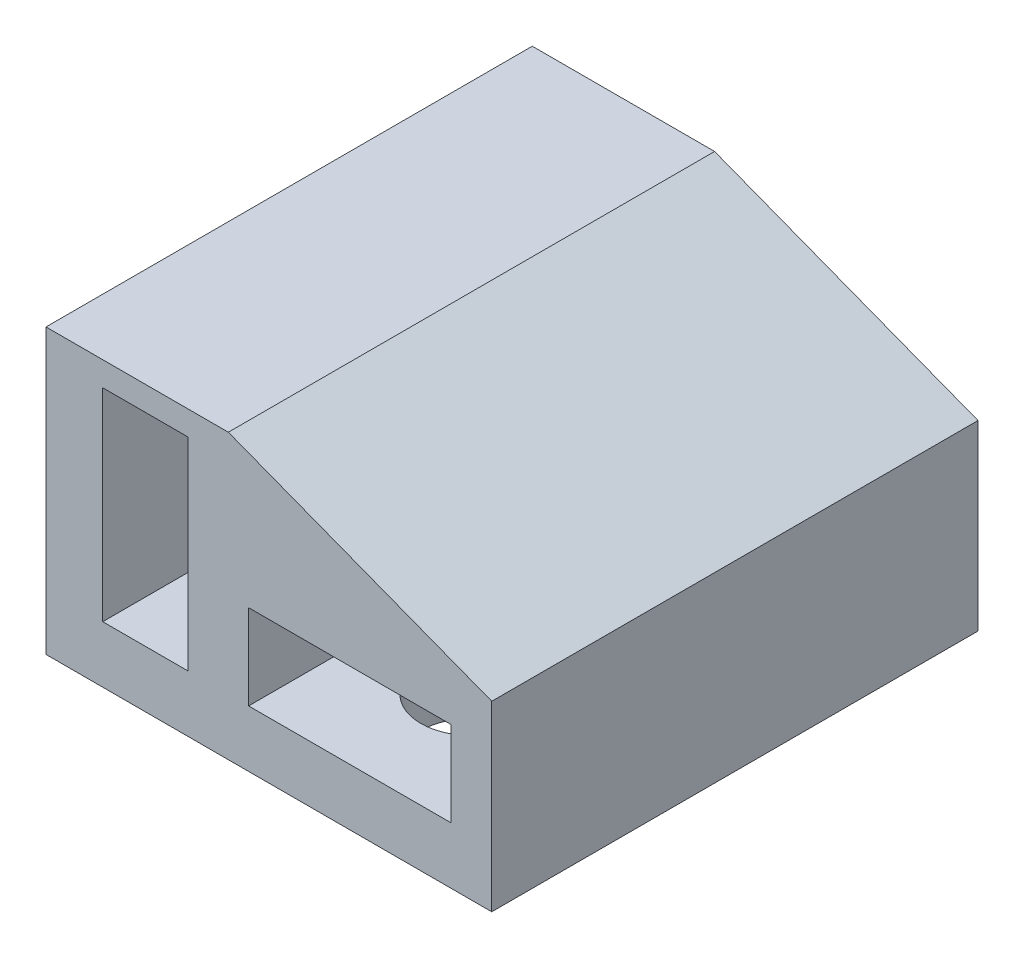
ISO-10303-21;
HEADER;
FILE_DESCRIPTION(('STEP AP214'),'2;1');
FILE_NAME('part.step','',(''),(''),'','','');
FILE_SCHEMA(('AUTOMOTIVE_DESIGN { 1 0 10303 214 1 1 1 1 }'));
ENDSEC;
DATA;
#1=APPLICATION_CONTEXT('core data for automotive mechanical design processes');
#2=APPLICATION_PROTOCOL_DEFINITION('international standard','automotive_design',2000,#1);
#3=PRODUCT_CONTEXT('',#1,'mechanical');
#4=PRODUCT('Part','Part','',(#3));
#5=PRODUCT_RELATED_PRODUCT_CATEGORY('part','',(#4));
#6=PRODUCT_DEFINITION_FORMATION('','',#4);
#7=PRODUCT_DEFINITION_CONTEXT('part definition',#1,'design');
#8=PRODUCT_DEFINITION('design','',#6,#7);
#9=PRODUCT_DEFINITION_SHAPE('','',#8);
#10=(LENGTH_UNIT() NAMED_UNIT(*) SI_UNIT(.MILLI.,.METRE.));
#11=(NAMED_UNIT(*) PLANE_ANGLE_UNIT() SI_UNIT($,.RADIAN.));
#12=(NAMED_UNIT(*) SI_UNIT($,.STERADIAN.) SOLID_ANGLE_UNIT());
#13=UNCERTAINTY_MEASURE_WITH_UNIT(LENGTH_MEASURE(1.E-05),#10,'distance_accuracy_value','');
#14=(GEOMETRIC_REPRESENTATION_CONTEXT(3) GLOBAL_UNCERTAINTY_ASSIGNED_CONTEXT((#13)) GLOBAL_UNIT_ASSIGNED_CONTEXT((#10,
#11,#12)) REPRESENTATION_CONTEXT('',''));
#15=CARTESIAN_POINT('',(0.,0.,0.));
#16=DIRECTION('',(0.,0.,1.));
#17=DIRECTION('',(1.,0.,0.));
#18=AXIS2_PLACEMENT_3D('',#15,#16,#17);
#19=CARTESIAN_POINT('',(0.,0.,12.));
#20=DIRECTION('',(0.,1.,0.));
#21=DIRECTION('',(0.,0.,1.));
#22=AXIS2_PLACEMENT_3D('',#19,#20,#21);
#23=PLANE('',#22);
#24=CARTESIAN_POINT('',(7.5,0.,9.));
#25=DIRECTION('',(0.,-1.,0.));
#26=DIRECTION('',(0.,0.,-1.));
#27=AXIS2_PLACEMENT_3D('',#24,#25,#26);
#28=CIRCLE('',#27,1.25);
#29=CARTESIAN_POINT('',(7.5,0.,7.75));
#30=VERTEX_POINT('',#29);
#31=EDGE_CURVE('E545',#30,#30,#28,.T.);
#32=ORIENTED_EDGE('',*,*,#31,.F.);
#33=EDGE_LOOP('',(#32));
#34=FACE_BOUND('',#33,.T.);
#35=CARTESIAN_POINT('',(7.5,0.,3.));
#36=DIRECTION('',(0.,-1.,0.));
#37=DIRECTION('',(0.,0.,-1.));
#38=AXIS2_PLACEMENT_3D('',#35,#36,#37);
#39=CIRCLE('',#38,1.25);
#40=CARTESIAN_POINT('',(7.5,0.,1.75));
#41=VERTEX_POINT('',#40);
#42=EDGE_CURVE('E549',#41,#41,#39,.T.);
#43=ORIENTED_EDGE('',*,*,#42,.F.);
#44=EDGE_LOOP('',(#43));
#45=FACE_BOUND('',#44,.T.);
#46=DIRECTION('',(1.,0.,0.));
#47=VECTOR('',#46,1.);
#48=CARTESIAN_POINT('',(0.,0.,0.));
#49=LINE('',#48,#47);
#50=CARTESIAN_POINT('',(0.,0.,0.));
#51=VERTEX_POINT('',#50);
#52=CARTESIAN_POINT('',(11.,0.,0.));
#53=VERTEX_POINT('',#52);
#54=EDGE_CURVE('E383',#51,#53,#49,.T.);
#55=ORIENTED_EDGE('',*,*,#54,.T.);
#56=DIRECTION('',(0.,0.,-1.));
#57=VECTOR('',#56,1.);
#58=CARTESIAN_POINT('',(11.,0.,12.));
#59=LINE('',#58,#57);
#60=CARTESIAN_POINT('',(11.,0.,12.));
#61=VERTEX_POINT('',#60);
#62=EDGE_CURVE('E480',#61,#53,#59,.T.);
#63=ORIENTED_EDGE('',*,*,#62,.F.);
#64=DIRECTION('',(1.,0.,0.));
#65=VECTOR('',#64,1.);
#66=CARTESIAN_POINT('',(0.,0.,12.));
#67=LINE('',#66,#65);
#68=CARTESIAN_POINT('',(0.,0.,12.));
#69=VERTEX_POINT('',#68);
#70=EDGE_CURVE('E435',#69,#61,#67,.T.);
#71=ORIENTED_EDGE('',*,*,#70,.F.);
#72=DIRECTION('',(0.,0.,-1.));
#73=VECTOR('',#72,1.);
#74=CARTESIAN_POINT('',(0.,0.,12.));
#75=LINE('',#74,#73);
#76=EDGE_CURVE('E451',#69,#51,#75,.T.);
#77=ORIENTED_EDGE('',*,*,#76,.T.);
#78=EDGE_LOOP('',(#55,#63,#71,#77));
#79=FACE_BOUND('',#78,.T.);
#80=ADVANCED_FACE('F78',(#34,#45,#79),#23,.F.);
#81=CARTESIAN_POINT('',(11.,0.,12.));
#82=DIRECTION('',(-1.,0.,0.));
#83=DIRECTION('',(0.,0.,1.));
#84=AXIS2_PLACEMENT_3D('',#81,#82,#83);
#85=PLANE('',#84);
#86=DIRECTION('',(0.,0.,-1.));
#87=VECTOR('',#86,1.);
#88=CARTESIAN_POINT('',(11.,4.5,12.));
#89=LINE('',#88,#87);
#90=CARTESIAN_POINT('',(11.,4.5,12.));
#91=VERTEX_POINT('',#90);
#92=CARTESIAN_POINT('',(11.,4.5,0.));
#93=VERTEX_POINT('',#92);
#94=EDGE_CURVE('E476',#91,#93,#89,.T.);
#95=ORIENTED_EDGE('',*,*,#94,.F.);
#96=DIRECTION('',(0.,1.,0.));
#97=VECTOR('',#96,1.);
#98=CARTESIAN_POINT('',(11.,0.,12.));
#99=LINE('',#98,#97);
#100=EDGE_CURVE('E438',#61,#91,#99,.T.);
#101=ORIENTED_EDGE('',*,*,#100,.F.);
#102=ORIENTED_EDGE('',*,*,#62,.T.);
#103=DIRECTION('',(0.,1.,0.));
#104=VECTOR('',#103,1.);
#105=CARTESIAN_POINT('',(11.,0.,0.));
#106=LINE('',#105,#104);
#107=EDGE_CURVE('E454',#53,#93,#106,.T.);
#108=ORIENTED_EDGE('',*,*,#107,.T.);
#109=EDGE_LOOP('',(#95,#101,#102,#108));
#110=FACE_BOUND('',#109,.T.);
#111=ADVANCED_FACE('F535',(#110),#85,.F.);
#112=CARTESIAN_POINT('',(4.5,7.,12.));
#113=DIRECTION('',(-0.358979079308869,-0.933345606203059,0.));
#114=DIRECTION('',(0.93334560620306,-0.358979079308869,0.));
#115=AXIS2_PLACEMENT_3D('',#112,#113,#114);
#116=PLANE('',#115);
#117=DIRECTION('',(-0.93334560620306,0.358979079308869,0.));
#118=VECTOR('',#117,1.);
#119=CARTESIAN_POINT('',(4.5,7.,0.));
#120=LINE('',#119,#118);
#121=CARTESIAN_POINT('',(4.5,7.,0.));
#122=VERTEX_POINT('',#121);
#123=EDGE_CURVE('E457',#93,#122,#120,.T.);
#124=ORIENTED_EDGE('',*,*,#123,.T.);
#125=DIRECTION('',(0.,0.,-1.));
#126=VECTOR('',#125,1.);
#127=CARTESIAN_POINT('',(4.5,7.,12.));
#128=LINE('',#127,#126);
#129=CARTESIAN_POINT('',(4.5,7.,12.));
#130=VERTEX_POINT('',#129);
#131=EDGE_CURVE('E472',#130,#122,#128,.T.);
#132=ORIENTED_EDGE('',*,*,#131,.F.);
#133=DIRECTION('',(-0.93334560620306,0.358979079308869,0.));
#134=VECTOR('',#133,1.);
#135=CARTESIAN_POINT('',(4.5,7.,12.));
#136=LINE('',#135,#134);
#137=EDGE_CURVE('E442',#91,#130,#136,.T.);
#138=ORIENTED_EDGE('',*,*,#137,.F.);
#139=ORIENTED_EDGE('',*,*,#94,.T.);
#140=EDGE_LOOP('',(#124,#132,#138,#139));
#141=FACE_BOUND('',#140,.T.);
#142=ADVANCED_FACE('F540',(#141),#116,.F.);
#143=CARTESIAN_POINT('',(0.,7.,12.));
#144=DIRECTION('',(0.,-1.,0.));
#145=DIRECTION('',(0.,0.,-1.));
#146=AXIS2_PLACEMENT_3D('',#143,#144,#145);
#147=PLANE('',#146);
#148=DIRECTION('',(-1.,0.,0.));
#149=VECTOR('',#148,1.);
#150=CARTESIAN_POINT('',(0.,7.,0.));
#151=LINE('',#150,#149);
#152=CARTESIAN_POINT('',(0.,7.,0.));
#153=VERTEX_POINT('',#152);
#154=EDGE_CURVE('E460',#122,#153,#151,.T.);
#155=ORIENTED_EDGE('',*,*,#154,.T.);
#156=DIRECTION('',(0.,0.,-1.));
#157=VECTOR('',#156,1.);
#158=CARTESIAN_POINT('',(0.,7.,12.));
#159=LINE('',#158,#157);
#160=CARTESIAN_POINT('',(0.,7.,12.));
#161=VERTEX_POINT('',#160);
#162=EDGE_CURVE('E468',#161,#153,#159,.T.);
#163=ORIENTED_EDGE('',*,*,#162,.F.);
#164=DIRECTION('',(-1.,0.,0.));
#165=VECTOR('',#164,1.);
#166=CARTESIAN_POINT('',(0.,7.,12.));
#167=LINE('',#166,#165);
#168=EDGE_CURVE('E445',#130,#161,#167,.T.);
#169=ORIENTED_EDGE('',*,*,#168,.F.);
#170=ORIENTED_EDGE('',*,*,#131,.T.);
#171=EDGE_LOOP('',(#155,#163,#169,#170));
#172=FACE_BOUND('',#171,.T.);
#173=ADVANCED_FACE('F570',(#172),#147,.F.);
#174=CARTESIAN_POINT('',(0.,0.,12.));
#175=DIRECTION('',(1.,0.,0.));
#176=DIRECTION('',(0.,0.,-1.));
#177=AXIS2_PLACEMENT_3D('',#174,#175,#176);
#178=PLANE('',#177);
#179=CARTESIAN_POINT('',(0.,3.9,3.5));
#180=DIRECTION('',(-1.,0.,0.));
#181=DIRECTION('',(0.,0.,1.));
#182=AXIS2_PLACEMENT_3D('',#179,#180,#181);
#183=CIRCLE('',#182,1.25);
#184=CARTESIAN_POINT('',(0.,3.9,4.75));
#185=VERTEX_POINT('',#184);
#186=EDGE_CURVE('E489',#185,#185,#183,.T.);
#187=ORIENTED_EDGE('',*,*,#186,.F.);
#188=EDGE_LOOP('',(#187));
#189=FACE_BOUND('',#188,.T.);
#190=CARTESIAN_POINT('',(0.,3.9,8.5));
#191=DIRECTION('',(-1.,0.,0.));
#192=DIRECTION('',(0.,0.,1.));
#193=AXIS2_PLACEMENT_3D('',#190,#191,#192);
#194=CIRCLE('',#193,1.25);
#195=CARTESIAN_POINT('',(0.,3.9,9.75));
#196=VERTEX_POINT('',#195);
#197=EDGE_CURVE('E642',#196,#196,#194,.T.);
#198=ORIENTED_EDGE('',*,*,#197,.F.);
#199=EDGE_LOOP('',(#198));
#200=FACE_BOUND('',#199,.T.);
#201=DIRECTION('',(0.,-1.,0.));
#202=VECTOR('',#201,1.);
#203=CARTESIAN_POINT('',(0.,0.,0.));
#204=LINE('',#203,#202);
#205=EDGE_CURVE('E439',#153,#51,#204,.T.);
#206=ORIENTED_EDGE('',*,*,#205,.T.);
#207=ORIENTED_EDGE('',*,*,#76,.F.);
#208=DIRECTION('',(0.,-1.,0.));
#209=VECTOR('',#208,1.);
#210=CARTESIAN_POINT('',(0.,0.,12.));
#211=LINE('',#210,#209);
#212=EDGE_CURVE('E448',#161,#69,#211,.T.);
#213=ORIENTED_EDGE('',*,*,#212,.F.);
#214=ORIENTED_EDGE('',*,*,#162,.T.);
#215=EDGE_LOOP('',(#206,#207,#213,#214));
#216=FACE_BOUND('',#215,.T.);
#217=ADVANCED_FACE('F568',(#189,#200,#216),#178,.F.);
#218=CARTESIAN_POINT('',(0.,0.,12.));
#219=DIRECTION('',(0.,0.,1.));
#220=DIRECTION('',(1.,0.,0.));
#221=AXIS2_PLACEMENT_3D('',#218,#219,#220);
#222=PLANE('',#221);
#223=DIRECTION('',(0.,-1.,0.));
#224=VECTOR('',#223,1.);
#225=CARTESIAN_POINT('',(10.,3.5,12.));
#226=LINE('',#225,#224);
#227=CARTESIAN_POINT('',(10.,3.5,12.));
#228=VERTEX_POINT('',#227);
#229=CARTESIAN_POINT('',(10.,1.4,12.));
#230=VERTEX_POINT('',#229);
#231=EDGE_CURVE('E292',#228,#230,#226,.T.);
#232=ORIENTED_EDGE('',*,*,#231,.T.);
#233=DIRECTION('',(1.,0.,0.));
#234=VECTOR('',#233,1.);
#235=CARTESIAN_POINT('',(11.,1.4,12.));
#236=LINE('',#235,#234);
#237=CARTESIAN_POINT('',(5.,1.4,12.));
#238=VERTEX_POINT('',#237);
#239=EDGE_CURVE('E259',#238,#230,#236,.T.);
#240=ORIENTED_EDGE('',*,*,#239,.F.);
#241=DIRECTION('',(0.,-1.,0.));
#242=VECTOR('',#241,1.);
#243=CARTESIAN_POINT('',(5.,3.5,12.));
#244=LINE('',#243,#242);
#245=CARTESIAN_POINT('',(5.,3.5,12.));
#246=VERTEX_POINT('',#245);
#247=EDGE_CURVE('E295',#246,#238,#244,.T.);
#248=ORIENTED_EDGE('',*,*,#247,.F.);
#249=DIRECTION('',(-1.,0.,0.));
#250=VECTOR('',#249,1.);
#251=CARTESIAN_POINT('',(0.,3.5,12.));
#252=LINE('',#251,#250);
#253=EDGE_CURVE('E311',#228,#246,#252,.T.);
#254=ORIENTED_EDGE('',*,*,#253,.F.);
#255=EDGE_LOOP('',(#232,#240,#248,#254));
#256=FACE_BOUND('',#255,.T.);
#257=ORIENTED_EDGE('',*,*,#100,.T.);
#258=ORIENTED_EDGE('',*,*,#137,.T.);
#259=ORIENTED_EDGE('',*,*,#168,.T.);
#260=ORIENTED_EDGE('',*,*,#212,.T.);
#261=ORIENTED_EDGE('',*,*,#70,.T.);
#262=EDGE_LOOP('',(#257,#258,#259,#260,#261));
#263=FACE_BOUND('',#262,.T.);
#264=DIRECTION('',(-1.,0.,0.));
#265=VECTOR('',#264,1.);
#266=CARTESIAN_POINT('',(3.5,1.4,12.));
#267=LINE('',#266,#265);
#268=CARTESIAN_POINT('',(3.5,1.4,12.));
#269=VERTEX_POINT('',#268);
#270=CARTESIAN_POINT('',(1.4,1.4,12.));
#271=VERTEX_POINT('',#270);
#272=EDGE_CURVE('E417',#269,#271,#267,.T.);
#273=ORIENTED_EDGE('',*,*,#272,.T.);
#274=DIRECTION('',(0.,1.,0.));
#275=VECTOR('',#274,1.);
#276=CARTESIAN_POINT('',(1.4,0.,12.));
#277=LINE('',#276,#275);
#278=CARTESIAN_POINT('',(1.4,6.4,12.));
#279=VERTEX_POINT('',#278);
#280=EDGE_CURVE('E328',#271,#279,#277,.T.);
#281=ORIENTED_EDGE('',*,*,#280,.T.);
#282=DIRECTION('',(-1.,0.,0.));
#283=VECTOR('',#282,1.);
#284=CARTESIAN_POINT('',(3.5,6.4,12.));
#285=LINE('',#284,#283);
#286=CARTESIAN_POINT('',(3.5,6.4,12.));
#287=VERTEX_POINT('',#286);
#288=EDGE_CURVE('E429',#287,#279,#285,.T.);
#289=ORIENTED_EDGE('',*,*,#288,.F.);
#290=DIRECTION('',(0.,1.,0.));
#291=VECTOR('',#290,1.);
#292=CARTESIAN_POINT('',(3.5,0.,12.));
#293=LINE('',#292,#291);
#294=EDGE_CURVE('E401',#269,#287,#293,.T.);
#295=ORIENTED_EDGE('',*,*,#294,.F.);
#296=EDGE_LOOP('',(#273,#281,#289,#295));
#297=FACE_BOUND('',#296,.T.);
#298=ADVANCED_FACE('F514',(#256,#263,#297),#222,.T.);
#299=CARTESIAN_POINT('',(0.,0.,0.));
#300=DIRECTION('',(0.,0.,1.));
#301=DIRECTION('',(1.,0.,0.));
#302=AXIS2_PLACEMENT_3D('',#299,#300,#301);
#303=PLANE('',#302);
#304=DIRECTION('',(1.,0.,0.));
#305=VECTOR('',#304,1.);
#306=CARTESIAN_POINT('',(11.,1.4,0.));
#307=LINE('',#306,#305);
#308=CARTESIAN_POINT('',(5.,1.4,0.));
#309=VERTEX_POINT('',#308);
#310=CARTESIAN_POINT('',(10.,1.4,0.));
#311=VERTEX_POINT('',#310);
#312=EDGE_CURVE('E247',#309,#311,#307,.T.);
#313=ORIENTED_EDGE('',*,*,#312,.T.);
#314=DIRECTION('',(0.,-1.,0.));
#315=VECTOR('',#314,1.);
#316=CARTESIAN_POINT('',(10.,3.5,0.));
#317=LINE('',#316,#315);
#318=CARTESIAN_POINT('',(10.,3.5,0.));
#319=VERTEX_POINT('',#318);
#320=EDGE_CURVE('E278',#319,#311,#317,.T.);
#321=ORIENTED_EDGE('',*,*,#320,.F.);
#322=DIRECTION('',(1.,0.,0.));
#323=VECTOR('',#322,1.);
#324=CARTESIAN_POINT('',(0.,3.5,0.));
#325=LINE('',#324,#323);
#326=CARTESIAN_POINT('',(5.,3.5,0.));
#327=VERTEX_POINT('',#326);
#328=EDGE_CURVE('E276',#327,#319,#325,.T.);
#329=ORIENTED_EDGE('',*,*,#328,.F.);
#330=DIRECTION('',(0.,-1.,0.));
#331=VECTOR('',#330,1.);
#332=CARTESIAN_POINT('',(5.,3.5,0.));
#333=LINE('',#332,#331);
#334=EDGE_CURVE('E267',#327,#309,#333,.T.);
#335=ORIENTED_EDGE('',*,*,#334,.T.);
#336=EDGE_LOOP('',(#313,#321,#329,#335));
#337=FACE_BOUND('',#336,.T.);
#338=ORIENTED_EDGE('',*,*,#123,.F.);
#339=ORIENTED_EDGE('',*,*,#107,.F.);
#340=ORIENTED_EDGE('',*,*,#54,.F.);
#341=ORIENTED_EDGE('',*,*,#205,.F.);
#342=ORIENTED_EDGE('',*,*,#154,.F.);
#343=EDGE_LOOP('',(#338,#339,#340,#341,#342));
#344=FACE_BOUND('',#343,.T.);
#345=DIRECTION('',(0.,1.,0.));
#346=VECTOR('',#345,1.);
#347=CARTESIAN_POINT('',(1.4,0.,0.));
#348=LINE('',#347,#346);
#349=CARTESIAN_POINT('',(1.4,1.4,0.));
#350=VERTEX_POINT('',#349);
#351=CARTESIAN_POINT('',(1.4,6.4,0.));
#352=VERTEX_POINT('',#351);
#353=EDGE_CURVE('E324',#350,#352,#348,.T.);
#354=ORIENTED_EDGE('',*,*,#353,.F.);
#355=DIRECTION('',(-1.,0.,0.));
#356=VECTOR('',#355,1.);
#357=CARTESIAN_POINT('',(3.5,1.4,0.));
#358=LINE('',#357,#356);
#359=CARTESIAN_POINT('',(3.5,1.4,0.));
#360=VERTEX_POINT('',#359);
#361=EDGE_CURVE('E378',#360,#350,#358,.T.);
#362=ORIENTED_EDGE('',*,*,#361,.F.);
#363=DIRECTION('',(0.,-1.,0.));
#364=VECTOR('',#363,1.);
#365=CARTESIAN_POINT('',(3.5,0.,0.));
#366=LINE('',#365,#364);
#367=CARTESIAN_POINT('',(3.5,6.4,0.));
#368=VERTEX_POINT('',#367);
#369=EDGE_CURVE('E358',#368,#360,#366,.T.);
#370=ORIENTED_EDGE('',*,*,#369,.F.);
#371=DIRECTION('',(-1.,0.,0.));
#372=VECTOR('',#371,1.);
#373=CARTESIAN_POINT('',(3.5,6.4,0.));
#374=LINE('',#373,#372);
#375=EDGE_CURVE('E379',#368,#352,#374,.T.);
#376=ORIENTED_EDGE('',*,*,#375,.T.);
#377=EDGE_LOOP('',(#354,#362,#370,#376));
#378=FACE_BOUND('',#377,.T.);
#379=ADVANCED_FACE('F273',(#337,#344,#378),#303,.F.);
#380=CARTESIAN_POINT('',(3.5,6.4,0.));
#381=DIRECTION('',(0.,1.,0.));
#382=DIRECTION('',(0.,0.,1.));
#383=AXIS2_PLACEMENT_3D('',#380,#381,#382);
#384=PLANE('',#383);
#385=DIRECTION('',(-1.,0.,0.));
#386=VECTOR('',#385,1.);
#387=CARTESIAN_POINT('',(3.5,6.4,4.44337567297406));
#388=LINE('',#387,#386);
#389=CARTESIAN_POINT('',(3.5,6.4,4.44337567297406));
#390=VERTEX_POINT('',#389);
#391=CARTESIAN_POINT('',(1.4,6.4,4.44337567297406));
#392=VERTEX_POINT('',#391);
#393=EDGE_CURVE('E384',#390,#392,#388,.T.);
#394=ORIENTED_EDGE('',*,*,#393,.T.);
#395=DIRECTION('',(0.,0.,-1.));
#396=VECTOR('',#395,1.);
#397=CARTESIAN_POINT('',(1.4,6.4,0.));
#398=LINE('',#397,#396);
#399=EDGE_CURVE('E353',#392,#352,#398,.T.);
#400=ORIENTED_EDGE('',*,*,#399,.T.);
#401=ORIENTED_EDGE('',*,*,#375,.F.);
#402=DIRECTION('',(0.,0.,-1.));
#403=VECTOR('',#402,1.);
#404=CARTESIAN_POINT('',(3.5,6.4,0.));
#405=LINE('',#404,#403);
#406=EDGE_CURVE('E375',#390,#368,#405,.T.);
#407=ORIENTED_EDGE('',*,*,#406,.F.);
#408=EDGE_LOOP('',(#394,#400,#401,#407));
#409=FACE_BOUND('',#408,.T.);
#410=ADVANCED_FACE('F584',(#409),#384,.F.);
#411=CARTESIAN_POINT('',(3.5,3.52403810567665,6.10381304684075));
#412=DIRECTION('',(0.,0.5,0.866025403784439));
#413=DIRECTION('',(0.,-0.866025403784439,0.5));
#414=AXIS2_PLACEMENT_3D('',#411,#412,#413);
#415=PLANE('',#414);
#416=DIRECTION('',(-1.,0.,0.));
#417=VECTOR('',#416,1.);
#418=CARTESIAN_POINT('',(3.5,3.9,5.88675134594812));
#419=LINE('',#418,#417);
#420=CARTESIAN_POINT('',(3.5,3.9,5.88675134594812));
#421=VERTEX_POINT('',#420);
#422=CARTESIAN_POINT('',(1.4,3.9,5.88675134594812));
#423=VERTEX_POINT('',#422);
#424=EDGE_CURVE('E388',#421,#423,#419,.T.);
#425=ORIENTED_EDGE('',*,*,#424,.T.);
#426=DIRECTION('',(0.,0.866025403784439,-0.5));
#427=VECTOR('',#426,1.);
#428=CARTESIAN_POINT('',(1.4,3.52403810567665,6.10381304684075));
#429=LINE('',#428,#427);
#430=EDGE_CURVE('E349',#423,#392,#429,.T.);
#431=ORIENTED_EDGE('',*,*,#430,.T.);
#432=ORIENTED_EDGE('',*,*,#393,.F.);
#433=DIRECTION('',(0.,0.866025403784439,-0.5));
#434=VECTOR('',#433,1.);
#435=CARTESIAN_POINT('',(3.5,3.52403810567665,6.10381304684075));
#436=LINE('',#435,#434);
#437=EDGE_CURVE('E371',#421,#390,#436,.T.);
#438=ORIENTED_EDGE('',*,*,#437,.F.);
#439=EDGE_LOOP('',(#425,#431,#432,#438));
#440=FACE_BOUND('',#439,.T.);
#441=ADVANCED_FACE('F607',(#440),#415,.F.);
#442=CARTESIAN_POINT('',(3.5,-1.57403810567666,2.72631397208144));
#443=DIRECTION('',(0.,-0.499999999999999,0.866025403784439));
#444=DIRECTION('',(0.,-0.866025403784439,-0.499999999999999));
#445=AXIS2_PLACEMENT_3D('',#442,#443,#444);
#446=PLANE('',#445);
#447=DIRECTION('',(-1.,0.,0.));
#448=VECTOR('',#447,1.);
#449=CARTESIAN_POINT('',(3.5,1.4,4.44337567297406));
#450=LINE('',#449,#448);
#451=CARTESIAN_POINT('',(3.5,1.4,4.44337567297406));
#452=VERTEX_POINT('',#451);
#453=CARTESIAN_POINT('',(1.4,1.4,4.44337567297406));
#454=VERTEX_POINT('',#453);
#455=EDGE_CURVE('E392',#452,#454,#450,.T.);
#456=ORIENTED_EDGE('',*,*,#455,.T.);
#457=DIRECTION('',(0.,0.866025403784439,0.499999999999999));
#458=VECTOR('',#457,1.);
#459=CARTESIAN_POINT('',(1.4,-1.57403810567666,2.72631397208144));
#460=LINE('',#459,#458);
#461=EDGE_CURVE('E345',#454,#423,#460,.T.);
#462=ORIENTED_EDGE('',*,*,#461,.T.);
#463=ORIENTED_EDGE('',*,*,#424,.F.);
#464=DIRECTION('',(0.,0.866025403784439,0.5));
#465=VECTOR('',#464,1.);
#466=CARTESIAN_POINT('',(3.5,-1.57403810567666,2.72631397208144));
#467=LINE('',#466,#465);
#468=EDGE_CURVE('E367',#452,#421,#467,.T.);
#469=ORIENTED_EDGE('',*,*,#468,.F.);
#470=EDGE_LOOP('',(#456,#462,#463,#469));
#471=FACE_BOUND('',#470,.T.);
#472=ADVANCED_FACE('F600',(#471),#446,.F.);
#473=CARTESIAN_POINT('',(3.5,1.4,0.));
#474=DIRECTION('',(0.,-1.,0.));
#475=DIRECTION('',(0.,0.,-1.));
#476=AXIS2_PLACEMENT_3D('',#473,#474,#475);
#477=PLANE('',#476);
#478=ORIENTED_EDGE('',*,*,#361,.T.);
#479=DIRECTION('',(0.,0.,1.));
#480=VECTOR('',#479,1.);
#481=CARTESIAN_POINT('',(1.4,1.4,0.));
#482=LINE('',#481,#480);
#483=EDGE_CURVE('E341',#350,#454,#482,.T.);
#484=ORIENTED_EDGE('',*,*,#483,.T.);
#485=ORIENTED_EDGE('',*,*,#455,.F.);
#486=DIRECTION('',(0.,0.,1.));
#487=VECTOR('',#486,1.);
#488=CARTESIAN_POINT('',(3.5,1.4,0.));
#489=LINE('',#488,#487);
#490=EDGE_CURVE('E362',#360,#452,#489,.T.);
#491=ORIENTED_EDGE('',*,*,#490,.F.);
#492=EDGE_LOOP('',(#478,#484,#485,#491));
#493=FACE_BOUND('',#492,.T.);
#494=ADVANCED_FACE('F594',(#493),#477,.F.);
#495=CARTESIAN_POINT('',(3.5,0.,0.));
#496=DIRECTION('',(-1.,0.,0.));
#497=DIRECTION('',(0.,0.,1.));
#498=AXIS2_PLACEMENT_3D('',#495,#496,#497);
#499=PLANE('',#498);
#500=ORIENTED_EDGE('',*,*,#369,.T.);
#501=ORIENTED_EDGE('',*,*,#490,.T.);
#502=ORIENTED_EDGE('',*,*,#468,.T.);
#503=ORIENTED_EDGE('',*,*,#437,.T.);
#504=ORIENTED_EDGE('',*,*,#406,.T.);
#505=EDGE_LOOP('',(#500,#501,#502,#503,#504));
#506=FACE_BOUND('',#505,.T.);
#507=ADVANCED_FACE('F588',(#506),#499,.T.);
#508=CARTESIAN_POINT('',(3.5,1.4,0.));
#509=DIRECTION('',(0.,-1.,0.));
#510=DIRECTION('',(0.,0.,-1.));
#511=AXIS2_PLACEMENT_3D('',#508,#509,#510);
#512=PLANE('',#511);
#513=DIRECTION('',(-1.,0.,0.));
#514=VECTOR('',#513,1.);
#515=CARTESIAN_POINT('',(3.5,1.4,7.55662432702594));
#516=LINE('',#515,#514);
#517=CARTESIAN_POINT('',(3.5,1.4,7.55662432702594));
#518=VERTEX_POINT('',#517);
#519=CARTESIAN_POINT('',(1.4,1.4,7.55662432702594));
#520=VERTEX_POINT('',#519);
#521=EDGE_CURVE('E363',#518,#520,#516,.T.);
#522=ORIENTED_EDGE('',*,*,#521,.T.);
#523=DIRECTION('',(0.,0.,1.));
#524=VECTOR('',#523,1.);
#525=CARTESIAN_POINT('',(1.4,1.4,0.));
#526=LINE('',#525,#524);
#527=EDGE_CURVE('E338',#520,#271,#526,.T.);
#528=ORIENTED_EDGE('',*,*,#527,.T.);
#529=ORIENTED_EDGE('',*,*,#272,.F.);
#530=DIRECTION('',(0.,0.,1.));
#531=VECTOR('',#530,1.);
#532=CARTESIAN_POINT('',(3.5,1.4,0.));
#533=LINE('',#532,#531);
#534=EDGE_CURVE('E357',#518,#269,#533,.T.);
#535=ORIENTED_EDGE('',*,*,#534,.F.);
#536=EDGE_LOOP('',(#522,#528,#529,#535));
#537=FACE_BOUND('',#536,.T.);
#538=ADVANCED_FACE('F510',(#537),#512,.F.);
#539=CARTESIAN_POINT('',(3.5,3.62211431702997,6.27368602791856));
#540=DIRECTION('',(0.,-0.5,-0.866025403784439));
#541=DIRECTION('',(0.,0.866025403784439,-0.5));
#542=AXIS2_PLACEMENT_3D('',#539,#540,#541);
#543=PLANE('',#542);
#544=DIRECTION('',(-1.,0.,0.));
#545=VECTOR('',#544,1.);
#546=CARTESIAN_POINT('',(3.5,3.9,6.11324865405187));
#547=LINE('',#546,#545);
#548=CARTESIAN_POINT('',(3.5,3.9,6.11324865405187));
#549=VERTEX_POINT('',#548);
#550=CARTESIAN_POINT('',(1.4,3.9,6.11324865405187));
#551=VERTEX_POINT('',#550);
#552=EDGE_CURVE('E421',#549,#551,#547,.T.);
#553=ORIENTED_EDGE('',*,*,#552,.T.);
#554=DIRECTION('',(0.,-0.866025403784439,0.5));
#555=VECTOR('',#554,1.);
#556=CARTESIAN_POINT('',(1.4,3.62211431702997,6.27368602791856));
#557=LINE('',#556,#555);
#558=EDGE_CURVE('E335',#551,#520,#557,.T.);
#559=ORIENTED_EDGE('',*,*,#558,.T.);
#560=ORIENTED_EDGE('',*,*,#521,.F.);
#561=DIRECTION('',(0.,-0.866025403784439,0.5));
#562=VECTOR('',#561,1.);
#563=CARTESIAN_POINT('',(3.5,3.62211431702997,6.27368602791856));
#564=LINE('',#563,#562);
#565=EDGE_CURVE('E413',#549,#518,#564,.T.);
#566=ORIENTED_EDGE('',*,*,#565,.F.);
#567=EDGE_LOOP('',(#553,#559,#560,#566));
#568=FACE_BOUND('',#567,.T.);
#569=ADVANCED_FACE('F520',(#568),#543,.F.);
#570=CARTESIAN_POINT('',(3.5,-1.67211431702998,2.89618695315925));
#571=DIRECTION('',(0.,0.5,-0.866025403784439));
#572=DIRECTION('',(0.,0.866025403784439,0.5));
#573=AXIS2_PLACEMENT_3D('',#570,#571,#572);
#574=PLANE('',#573);
#575=DIRECTION('',(-1.,0.,0.));
#576=VECTOR('',#575,1.);
#577=CARTESIAN_POINT('',(3.5,6.4,7.55662432702594));
#578=LINE('',#577,#576);
#579=CARTESIAN_POINT('',(3.5,6.4,7.55662432702594));
#580=VERTEX_POINT('',#579);
#581=CARTESIAN_POINT('',(1.4,6.4,7.55662432702594));
#582=VERTEX_POINT('',#581);
#583=EDGE_CURVE('E425',#580,#582,#578,.T.);
#584=ORIENTED_EDGE('',*,*,#583,.T.);
#585=DIRECTION('',(0.,-0.866025403784439,-0.5));
#586=VECTOR('',#585,1.);
#587=CARTESIAN_POINT('',(1.4,-1.67211431702998,2.89618695315925));
#588=LINE('',#587,#586);
#589=EDGE_CURVE('E327',#582,#551,#588,.T.);
#590=ORIENTED_EDGE('',*,*,#589,.T.);
#591=ORIENTED_EDGE('',*,*,#552,.F.);
#592=DIRECTION('',(0.,-0.866025403784439,-0.5));
#593=VECTOR('',#592,1.);
#594=CARTESIAN_POINT('',(3.5,-1.67211431702998,2.89618695315925));
#595=LINE('',#594,#593);
#596=EDGE_CURVE('E409',#580,#549,#595,.T.);
#597=ORIENTED_EDGE('',*,*,#596,.F.);
#598=EDGE_LOOP('',(#584,#590,#591,#597));
#599=FACE_BOUND('',#598,.T.);
#600=ADVANCED_FACE('F522',(#599),#574,.F.);
#601=CARTESIAN_POINT('',(3.5,6.4,0.));
#602=DIRECTION('',(0.,1.,0.));
#603=DIRECTION('',(0.,0.,1.));
#604=AXIS2_PLACEMENT_3D('',#601,#602,#603);
#605=PLANE('',#604);
#606=ORIENTED_EDGE('',*,*,#288,.T.);
#607=DIRECTION('',(0.,0.,-1.));
#608=VECTOR('',#607,1.);
#609=CARTESIAN_POINT('',(1.4,6.4,0.));
#610=LINE('',#609,#608);
#611=EDGE_CURVE('E87',#279,#582,#610,.T.);
#612=ORIENTED_EDGE('',*,*,#611,.T.);
#613=ORIENTED_EDGE('',*,*,#583,.F.);
#614=DIRECTION('',(0.,0.,-1.));
#615=VECTOR('',#614,1.);
#616=CARTESIAN_POINT('',(3.5,6.4,0.));
#617=LINE('',#616,#615);
#618=EDGE_CURVE('E405',#287,#580,#617,.T.);
#619=ORIENTED_EDGE('',*,*,#618,.F.);
#620=EDGE_LOOP('',(#606,#612,#613,#619));
#621=FACE_BOUND('',#620,.T.);
#622=ADVANCED_FACE('F524',(#621),#605,.F.);
#623=CARTESIAN_POINT('',(3.5,0.,0.));
#624=DIRECTION('',(-1.,0.,0.));
#625=DIRECTION('',(0.,0.,1.));
#626=AXIS2_PLACEMENT_3D('',#623,#624,#625);
#627=PLANE('',#626);
#628=ORIENTED_EDGE('',*,*,#534,.T.);
#629=ORIENTED_EDGE('',*,*,#294,.T.);
#630=ORIENTED_EDGE('',*,*,#618,.T.);
#631=ORIENTED_EDGE('',*,*,#596,.T.);
#632=ORIENTED_EDGE('',*,*,#565,.T.);
#633=EDGE_LOOP('',(#628,#629,#630,#631,#632));
#634=FACE_BOUND('',#633,.T.);
#635=ADVANCED_FACE('F501',(#634),#627,.T.);
#636=CARTESIAN_POINT('',(1.4,0.,0.));
#637=DIRECTION('',(1.,0.,0.));
#638=DIRECTION('',(0.,0.,-1.));
#639=AXIS2_PLACEMENT_3D('',#636,#637,#638);
#640=PLANE('',#639);
#641=CARTESIAN_POINT('',(1.4,3.9,8.5));
#642=DIRECTION('',(1.,0.,0.));
#643=DIRECTION('',(0.,0.,-1.));
#644=AXIS2_PLACEMENT_3D('',#641,#642,#643);
#645=CIRCLE('',#644,1.25);
#646=CARTESIAN_POINT('',(1.4,3.9,7.25));
#647=VERTEX_POINT('',#646);
#648=EDGE_CURVE('E260',#647,#647,#645,.T.);
#649=ORIENTED_EDGE('',*,*,#648,.F.);
#650=EDGE_LOOP('',(#649));
#651=FACE_BOUND('',#650,.T.);
#652=ORIENTED_EDGE('',*,*,#527,.F.);
#653=ORIENTED_EDGE('',*,*,#558,.F.);
#654=ORIENTED_EDGE('',*,*,#589,.F.);
#655=ORIENTED_EDGE('',*,*,#611,.F.);
#656=ORIENTED_EDGE('',*,*,#280,.F.);
#657=EDGE_LOOP('',(#652,#653,#654,#655,#656));
#658=FACE_BOUND('',#657,.T.);
#659=ADVANCED_FACE('F497',(#651,#658),#640,.T.);
#660=CARTESIAN_POINT('',(1.4,3.9,3.5));
#661=DIRECTION('',(1.,0.,0.));
#662=DIRECTION('',(0.,0.,-1.));
#663=AXIS2_PLACEMENT_3D('',#660,#661,#662);
#664=CIRCLE('',#663,1.25);
#665=CARTESIAN_POINT('',(1.4,3.9,2.25));
#666=VERTEX_POINT('',#665);
#667=EDGE_CURVE('E486',#666,#666,#664,.T.);
#668=ORIENTED_EDGE('',*,*,#667,.F.);
#669=EDGE_LOOP('',(#668));
#670=FACE_BOUND('',#669,.T.);
#671=ORIENTED_EDGE('',*,*,#399,.F.);
#672=ORIENTED_EDGE('',*,*,#430,.F.);
#673=ORIENTED_EDGE('',*,*,#461,.F.);
#674=ORIENTED_EDGE('',*,*,#483,.F.);
#675=ORIENTED_EDGE('',*,*,#353,.T.);
#676=EDGE_LOOP('',(#671,#672,#673,#674,#675));
#677=FACE_BOUND('',#676,.T.);
#678=ADVANCED_FACE('F500',(#670,#677),#640,.T.);
#679=CARTESIAN_POINT('',(-0.674038105676657,3.5,1.16746824526945));
#680=DIRECTION('',(-0.500000000000001,0.,0.866025403784438));
#681=DIRECTION('',(0.866025403784438,0.,0.500000000000001));
#682=AXIS2_PLACEMENT_3D('',#679,#680,#681);
#683=PLANE('',#682);
#684=DIRECTION('',(0.,-1.,0.));
#685=VECTOR('',#684,1.);
#686=CARTESIAN_POINT('',(7.5,3.5,5.88675134594813));
#687=LINE('',#686,#685);
#688=CARTESIAN_POINT('',(7.5,3.5,5.88675134594813));
#689=VERTEX_POINT('',#688);
#690=CARTESIAN_POINT('',(7.5,1.4,5.88675134594813));
#691=VERTEX_POINT('',#690);
#692=EDGE_CURVE('E332',#689,#691,#687,.T.);
#693=ORIENTED_EDGE('',*,*,#692,.T.);
#694=DIRECTION('',(-0.866025403784438,0.,-0.500000000000001));
#695=VECTOR('',#694,1.);
#696=CARTESIAN_POINT('',(-0.674038105676657,1.4,1.16746824526945));
#697=LINE('',#696,#695);
#698=CARTESIAN_POINT('',(5.,1.4,4.44337567297406));
#699=VERTEX_POINT('',#698);
#700=EDGE_CURVE('E271',#691,#699,#697,.T.);
#701=ORIENTED_EDGE('',*,*,#700,.T.);
#702=DIRECTION('',(0.,-1.,0.));
#703=VECTOR('',#702,1.);
#704=CARTESIAN_POINT('',(5.,3.5,4.44337567297406));
#705=LINE('',#704,#703);
#706=CARTESIAN_POINT('',(5.,3.5,4.44337567297406));
#707=VERTEX_POINT('',#706);
#708=EDGE_CURVE('E269',#707,#699,#705,.T.);
#709=ORIENTED_EDGE('',*,*,#708,.F.);
#710=DIRECTION('',(-0.866025403784438,0.,-0.500000000000001));
#711=VECTOR('',#710,1.);
#712=CARTESIAN_POINT('',(-0.674038105676657,3.5,1.16746824526945));
#713=LINE('',#712,#711);
#714=EDGE_CURVE('E323',#689,#707,#713,.T.);
#715=ORIENTED_EDGE('',*,*,#714,.F.);
#716=EDGE_LOOP('',(#693,#701,#709,#715));
#717=FACE_BOUND('',#716,.T.);
#718=ADVANCED_FACE('F625',(#717),#683,.F.);
#719=CARTESIAN_POINT('',(4.42403810567666,3.5,7.66265877365274));
#720=DIRECTION('',(0.5,0.,0.866025403784439));
#721=DIRECTION('',(0.866025403784439,0.,-0.5));
#722=AXIS2_PLACEMENT_3D('',#719,#720,#721);
#723=PLANE('',#722);
#724=DIRECTION('',(0.,-1.,0.));
#725=VECTOR('',#724,1.);
#726=CARTESIAN_POINT('',(10.,3.5,4.44337567297406));
#727=LINE('',#726,#725);
#728=CARTESIAN_POINT('',(10.,3.5,4.44337567297406));
#729=VERTEX_POINT('',#728);
#730=CARTESIAN_POINT('',(10.,1.4,4.44337567297406));
#731=VERTEX_POINT('',#730);
#732=EDGE_CURVE('E282',#729,#731,#727,.T.);
#733=ORIENTED_EDGE('',*,*,#732,.T.);
#734=DIRECTION('',(-0.866025403784439,0.,0.5));
#735=VECTOR('',#734,1.);
#736=CARTESIAN_POINT('',(4.42403810567666,1.4,7.66265877365274));
#737=LINE('',#736,#735);
#738=EDGE_CURVE('E664',#731,#691,#737,.T.);
#739=ORIENTED_EDGE('',*,*,#738,.T.);
#740=ORIENTED_EDGE('',*,*,#692,.F.);
#741=DIRECTION('',(-0.866025403784439,0.,0.5));
#742=VECTOR('',#741,1.);
#743=CARTESIAN_POINT('',(4.42403810567666,3.5,7.66265877365274));
#744=LINE('',#743,#742);
#745=EDGE_CURVE('E284',#729,#689,#744,.T.);
#746=ORIENTED_EDGE('',*,*,#745,.F.);
#747=EDGE_LOOP('',(#733,#739,#740,#746));
#748=FACE_BOUND('',#747,.T.);
#749=ADVANCED_FACE('F630',(#748),#723,.F.);
#750=CARTESIAN_POINT('',(10.,3.5,0.));
#751=DIRECTION('',(1.,0.,0.));
#752=DIRECTION('',(0.,0.,-1.));
#753=AXIS2_PLACEMENT_3D('',#750,#751,#752);
#754=PLANE('',#753);
#755=ORIENTED_EDGE('',*,*,#320,.T.);
#756=DIRECTION('',(0.,0.,1.));
#757=VECTOR('',#756,1.);
#758=CARTESIAN_POINT('',(10.,1.4,0.));
#759=LINE('',#758,#757);
#760=EDGE_CURVE('E253',#311,#731,#759,.T.);
#761=ORIENTED_EDGE('',*,*,#760,.T.);
#762=ORIENTED_EDGE('',*,*,#732,.F.);
#763=DIRECTION('',(0.,0.,1.));
#764=VECTOR('',#763,1.);
#765=CARTESIAN_POINT('',(10.,3.5,0.));
#766=LINE('',#765,#764);
#767=EDGE_CURVE('E678',#319,#729,#766,.T.);
#768=ORIENTED_EDGE('',*,*,#767,.F.);
#769=EDGE_LOOP('',(#755,#761,#762,#768));
#770=FACE_BOUND('',#769,.T.);
#771=ADVANCED_FACE('F692',(#770),#754,.F.);
#772=CARTESIAN_POINT('',(5.,3.5,0.));
#773=DIRECTION('',(-1.,0.,0.));
#774=DIRECTION('',(0.,0.,1.));
#775=AXIS2_PLACEMENT_3D('',#772,#773,#774);
#776=PLANE('',#775);
#777=ORIENTED_EDGE('',*,*,#708,.T.);
#778=DIRECTION('',(0.,0.,-1.));
#779=VECTOR('',#778,1.);
#780=CARTESIAN_POINT('',(5.,1.4,0.));
#781=LINE('',#780,#779);
#782=EDGE_CURVE('E250',#699,#309,#781,.T.);
#783=ORIENTED_EDGE('',*,*,#782,.T.);
#784=ORIENTED_EDGE('',*,*,#334,.F.);
#785=DIRECTION('',(0.,0.,-1.));
#786=VECTOR('',#785,1.);
#787=CARTESIAN_POINT('',(5.,3.5,0.));
#788=LINE('',#787,#786);
#789=EDGE_CURVE('E673',#707,#327,#788,.T.);
#790=ORIENTED_EDGE('',*,*,#789,.F.);
#791=EDGE_LOOP('',(#777,#783,#784,#790));
#792=FACE_BOUND('',#791,.T.);
#793=ADVANCED_FACE('F265',(#792),#776,.F.);
#794=CARTESIAN_POINT('',(0.,3.5,0.));
#795=DIRECTION('',(0.,-1.,0.));
#796=DIRECTION('',(0.,0.,-1.));
#797=AXIS2_PLACEMENT_3D('',#794,#795,#796);
#798=PLANE('',#797);
#799=ORIENTED_EDGE('',*,*,#714,.T.);
#800=ORIENTED_EDGE('',*,*,#789,.T.);
#801=ORIENTED_EDGE('',*,*,#328,.T.);
#802=ORIENTED_EDGE('',*,*,#767,.T.);
#803=ORIENTED_EDGE('',*,*,#745,.T.);
#804=EDGE_LOOP('',(#799,#800,#801,#802,#803));
#805=FACE_BOUND('',#804,.T.);
#806=ADVANCED_FACE('F694',(#805),#798,.T.);
#807=CARTESIAN_POINT('',(-0.772114317029977,3.5,1.33734122634727));
#808=DIRECTION('',(0.5,0.,-0.866025403784439));
#809=DIRECTION('',(-0.866025403784439,0.,-0.5));
#810=AXIS2_PLACEMENT_3D('',#807,#808,#809);
#811=PLANE('',#810);
#812=DIRECTION('',(0.,-1.,0.));
#813=VECTOR('',#812,1.);
#814=CARTESIAN_POINT('',(7.5,3.5,6.11324865405187));
#815=LINE('',#814,#813);
#816=CARTESIAN_POINT('',(7.5,3.5,6.11324865405187));
#817=VERTEX_POINT('',#816);
#818=CARTESIAN_POINT('',(7.5,1.4,6.11324865405187));
#819=VERTEX_POINT('',#818);
#820=EDGE_CURVE('E302',#817,#819,#815,.T.);
#821=ORIENTED_EDGE('',*,*,#820,.T.);
#822=DIRECTION('',(0.866025403784439,0.,0.5));
#823=VECTOR('',#822,1.);
#824=CARTESIAN_POINT('',(-0.772114317029977,1.4,1.33734122634727));
#825=LINE('',#824,#823);
#826=CARTESIAN_POINT('',(10.,1.4,7.55662432702594));
#827=VERTEX_POINT('',#826);
#828=EDGE_CURVE('E103',#819,#827,#825,.T.);
#829=ORIENTED_EDGE('',*,*,#828,.T.);
#830=DIRECTION('',(0.,-1.,0.));
#831=VECTOR('',#830,1.);
#832=CARTESIAN_POINT('',(10.,3.5,7.55662432702594));
#833=LINE('',#832,#831);
#834=CARTESIAN_POINT('',(10.,3.5,7.55662432702594));
#835=VERTEX_POINT('',#834);
#836=EDGE_CURVE('E288',#835,#827,#833,.T.);
#837=ORIENTED_EDGE('',*,*,#836,.F.);
#838=DIRECTION('',(0.866025403784439,0.,0.5));
#839=VECTOR('',#838,1.);
#840=CARTESIAN_POINT('',(-0.772114317029977,3.5,1.33734122634727));
#841=LINE('',#840,#839);
#842=EDGE_CURVE('E319',#817,#835,#841,.T.);
#843=ORIENTED_EDGE('',*,*,#842,.F.);
#844=EDGE_LOOP('',(#821,#829,#837,#843));
#845=FACE_BOUND('',#844,.T.);
#846=ADVANCED_FACE('F697',(#845),#811,.F.);
#847=CARTESIAN_POINT('',(9.99999999999998,3.5,0.));
#848=DIRECTION('',(1.,0.,0.));
#849=DIRECTION('',(0.,0.,-1.));
#850=AXIS2_PLACEMENT_3D('',#847,#848,#849);
#851=PLANE('',#850);
#852=ORIENTED_EDGE('',*,*,#836,.T.);
#853=DIRECTION('',(0.,0.,1.));
#854=VECTOR('',#853,1.);
#855=CARTESIAN_POINT('',(9.99999999999998,1.4,0.));
#856=LINE('',#855,#854);
#857=EDGE_CURVE('E95',#827,#230,#856,.T.);
#858=ORIENTED_EDGE('',*,*,#857,.T.);
#859=ORIENTED_EDGE('',*,*,#231,.F.);
#860=DIRECTION('',(0.,0.,1.));
#861=VECTOR('',#860,1.);
#862=CARTESIAN_POINT('',(9.99999999999998,3.5,0.));
#863=LINE('',#862,#861);
#864=EDGE_CURVE('E315',#835,#228,#863,.T.);
#865=ORIENTED_EDGE('',*,*,#864,.F.);
#866=EDGE_LOOP('',(#852,#858,#859,#865));
#867=FACE_BOUND('',#866,.T.);
#868=ADVANCED_FACE('F703',(#867),#851,.F.);
#869=CARTESIAN_POINT('',(5.,3.5,0.));
#870=DIRECTION('',(1.,0.,0.));
#871=DIRECTION('',(0.,0.,-1.));
#872=AXIS2_PLACEMENT_3D('',#869,#870,#871);
#873=PLANE('',#872);
#874=DIRECTION('',(0.,0.,1.));
#875=VECTOR('',#874,1.);
#876=CARTESIAN_POINT('',(5.,1.4,0.));
#877=LINE('',#876,#875);
#878=CARTESIAN_POINT('',(5.,1.4,7.55662432702594));
#879=VERTEX_POINT('',#878);
#880=EDGE_CURVE('E653',#879,#238,#877,.T.);
#881=ORIENTED_EDGE('',*,*,#880,.F.);
#882=DIRECTION('',(0.,-1.,0.));
#883=VECTOR('',#882,1.);
#884=CARTESIAN_POINT('',(5.,3.5,7.55662432702594));
#885=LINE('',#884,#883);
#886=CARTESIAN_POINT('',(5.,3.5,7.55662432702594));
#887=VERTEX_POINT('',#886);
#888=EDGE_CURVE('E298',#887,#879,#885,.T.);
#889=ORIENTED_EDGE('',*,*,#888,.F.);
#890=DIRECTION('',(0.,0.,1.));
#891=VECTOR('',#890,1.);
#892=CARTESIAN_POINT('',(5.,3.5,0.));
#893=LINE('',#892,#891);
#894=EDGE_CURVE('E308',#887,#246,#893,.T.);
#895=ORIENTED_EDGE('',*,*,#894,.T.);
#896=ORIENTED_EDGE('',*,*,#247,.T.);
#897=EDGE_LOOP('',(#881,#889,#895,#896));
#898=FACE_BOUND('',#897,.T.);
#899=ADVANCED_FACE('F715',(#898),#873,.T.);
#900=CARTESIAN_POINT('',(4.52211431702998,3.5,7.83253175473055));
#901=DIRECTION('',(-0.5,0.,-0.866025403784438));
#902=DIRECTION('',(-0.866025403784438,0.,0.5));
#903=AXIS2_PLACEMENT_3D('',#900,#901,#902);
#904=PLANE('',#903);
#905=ORIENTED_EDGE('',*,*,#888,.T.);
#906=DIRECTION('',(0.866025403784438,0.,-0.5));
#907=VECTOR('',#906,1.);
#908=CARTESIAN_POINT('',(4.52211431702998,1.4,7.83253175473055));
#909=LINE('',#908,#907);
#910=EDGE_CURVE('E12',#879,#819,#909,.T.);
#911=ORIENTED_EDGE('',*,*,#910,.T.);
#912=ORIENTED_EDGE('',*,*,#820,.F.);
#913=DIRECTION('',(0.866025403784438,0.,-0.5));
#914=VECTOR('',#913,1.);
#915=CARTESIAN_POINT('',(4.52211431702998,3.5,7.83253175473055));
#916=LINE('',#915,#914);
#917=EDGE_CURVE('E291',#887,#817,#916,.T.);
#918=ORIENTED_EDGE('',*,*,#917,.F.);
#919=EDGE_LOOP('',(#905,#911,#912,#918));
#920=FACE_BOUND('',#919,.T.);
#921=ADVANCED_FACE('F718',(#920),#904,.F.);
#922=CARTESIAN_POINT('',(0.,3.5,0.));
#923=DIRECTION('',(0.,-1.,0.));
#924=DIRECTION('',(0.,0.,-1.));
#925=AXIS2_PLACEMENT_3D('',#922,#923,#924);
#926=PLANE('',#925);
#927=ORIENTED_EDGE('',*,*,#917,.T.);
#928=ORIENTED_EDGE('',*,*,#842,.T.);
#929=ORIENTED_EDGE('',*,*,#864,.T.);
#930=ORIENTED_EDGE('',*,*,#253,.T.);
#931=ORIENTED_EDGE('',*,*,#894,.F.);
#932=EDGE_LOOP('',(#927,#928,#929,#930,#931));
#933=FACE_BOUND('',#932,.T.);
#934=ADVANCED_FACE('F721',(#933),#926,.T.);
#935=CARTESIAN_POINT('',(11.,1.4,12.));
#936=DIRECTION('',(0.,1.,0.));
#937=DIRECTION('',(0.,0.,1.));
#938=AXIS2_PLACEMENT_3D('',#935,#936,#937);
#939=PLANE('',#938);
#940=CARTESIAN_POINT('',(7.5,1.4,9.));
#941=DIRECTION('',(0.,1.,0.));
#942=DIRECTION('',(0.,0.,1.));
#943=AXIS2_PLACEMENT_3D('',#940,#941,#942);
#944=CIRCLE('',#943,1.25);
#945=CARTESIAN_POINT('',(7.5,1.4,10.25));
#946=VERTEX_POINT('',#945);
#947=EDGE_CURVE('E81',#946,#946,#944,.T.);
#948=ORIENTED_EDGE('',*,*,#947,.F.);
#949=EDGE_LOOP('',(#948));
#950=FACE_BOUND('',#949,.T.);
#951=ORIENTED_EDGE('',*,*,#857,.F.);
#952=ORIENTED_EDGE('',*,*,#828,.F.);
#953=ORIENTED_EDGE('',*,*,#910,.F.);
#954=ORIENTED_EDGE('',*,*,#880,.T.);
#955=ORIENTED_EDGE('',*,*,#239,.T.);
#956=EDGE_LOOP('',(#951,#952,#953,#954,#955));
#957=FACE_BOUND('',#956,.T.);
#958=ADVANCED_FACE('F724',(#950,#957),#939,.T.);
#959=CARTESIAN_POINT('',(7.5,1.4,3.));
#960=DIRECTION('',(0.,1.,0.));
#961=DIRECTION('',(0.,0.,1.));
#962=AXIS2_PLACEMENT_3D('',#959,#960,#961);
#963=CIRCLE('',#962,1.25);
#964=CARTESIAN_POINT('',(7.5,1.4,4.25));
#965=VERTEX_POINT('',#964);
#966=EDGE_CURVE('E648',#965,#965,#963,.T.);
#967=ORIENTED_EDGE('',*,*,#966,.F.);
#968=EDGE_LOOP('',(#967));
#969=FACE_BOUND('',#968,.T.);
#970=ORIENTED_EDGE('',*,*,#760,.F.);
#971=ORIENTED_EDGE('',*,*,#312,.F.);
#972=ORIENTED_EDGE('',*,*,#782,.F.);
#973=ORIENTED_EDGE('',*,*,#700,.F.);
#974=ORIENTED_EDGE('',*,*,#738,.F.);
#975=EDGE_LOOP('',(#970,#971,#972,#973,#974));
#976=FACE_BOUND('',#975,.T.);
#977=ADVANCED_FACE('F249',(#969,#976),#939,.T.);
#978=CARTESIAN_POINT('',(3.5,3.9,3.5));
#979=DIRECTION('',(-1.,0.,0.));
#980=DIRECTION('',(0.,0.,1.));
#981=AXIS2_PLACEMENT_3D('',#978,#979,#980);
#982=CYLINDRICAL_SURFACE('',#981,1.25);
#983=ORIENTED_EDGE('',*,*,#667,.T.);
#984=EDGE_LOOP('',(#983));
#985=FACE_BOUND('',#984,.T.);
#986=ORIENTED_EDGE('',*,*,#186,.T.);
#987=EDGE_LOOP('',(#986));
#988=FACE_BOUND('',#987,.T.);
#989=ADVANCED_FACE('F635',(#985,#988),#982,.F.);
#990=CARTESIAN_POINT('',(3.5,3.9,8.5));
#991=DIRECTION('',(-1.,0.,0.));
#992=DIRECTION('',(0.,0.,1.));
#993=AXIS2_PLACEMENT_3D('',#990,#991,#992);
#994=CYLINDRICAL_SURFACE('',#993,1.25);
#995=ORIENTED_EDGE('',*,*,#648,.T.);
#996=EDGE_LOOP('',(#995));
#997=FACE_BOUND('',#996,.T.);
#998=ORIENTED_EDGE('',*,*,#197,.T.);
#999=EDGE_LOOP('',(#998));
#1000=FACE_BOUND('',#999,.T.);
#1001=ADVANCED_FACE('F494',(#997,#1000),#994,.F.);
#1002=CARTESIAN_POINT('',(7.5,3.5,3.));
#1003=DIRECTION('',(0.,-1.,0.));
#1004=DIRECTION('',(0.,0.,-1.));
#1005=AXIS2_PLACEMENT_3D('',#1002,#1003,#1004);
#1006=CYLINDRICAL_SURFACE('',#1005,1.25);
#1007=ORIENTED_EDGE('',*,*,#966,.T.);
#1008=EDGE_LOOP('',(#1007));
#1009=FACE_BOUND('',#1008,.T.);
#1010=ORIENTED_EDGE('',*,*,#42,.T.);
#1011=EDGE_LOOP('',(#1010));
#1012=FACE_BOUND('',#1011,.T.);
#1013=ADVANCED_FACE('F755',(#1009,#1012),#1006,.F.);
#1014=CARTESIAN_POINT('',(7.5,3.5,9.));
#1015=DIRECTION('',(0.,-1.,0.));
#1016=DIRECTION('',(0.,0.,-1.));
#1017=AXIS2_PLACEMENT_3D('',#1014,#1015,#1016);
#1018=CYLINDRICAL_SURFACE('',#1017,1.25);
#1019=ORIENTED_EDGE('',*,*,#947,.T.);
#1020=EDGE_LOOP('',(#1019));
#1021=FACE_BOUND('',#1020,.T.);
#1022=ORIENTED_EDGE('',*,*,#31,.T.);
#1023=EDGE_LOOP('',(#1022));
#1024=FACE_BOUND('',#1023,.T.);
#1025=ADVANCED_FACE('F757',(#1021,#1024),#1018,.F.);
#1026=CLOSED_SHELL('',(#80,#111,#142,#173,#217,#298,#379,#410,#441,#472,#494,#507,#538,#569,
#600,#622,#635,#659,#678,#718,#749,#771,#793,#806,#846,#868,#899,#921,#934,#958,#977,#989,#1001,
#1013,#1025));
#1027=MANIFOLD_SOLID_BREP('B2',#1026);
#1028=ADVANCED_BREP_SHAPE_REPRESENTATION('',(#18,#1027),#14);
#1029=SHAPE_DEFINITION_REPRESENTATION(#9,#1028);
ENDSEC;
END-ISO-10303-21;
